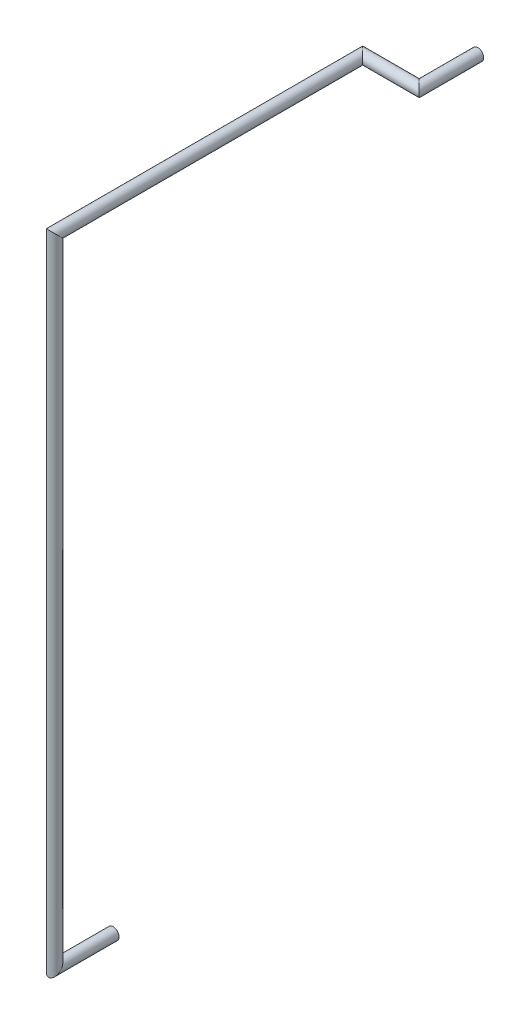
ISO-10303-21;
HEADER;
FILE_DESCRIPTION(('STEP AP214'),'2;1');
FILE_NAME('part.step','',(''),(''),'','','');
FILE_SCHEMA(('AUTOMOTIVE_DESIGN { 1 0 10303 214 1 1 1 1 }'));
ENDSEC;
DATA;
#1=APPLICATION_CONTEXT('core data for automotive mechanical design processes');
#2=APPLICATION_PROTOCOL_DEFINITION('international standard','automotive_design',2000,#1);
#3=PRODUCT_CONTEXT('',#1,'mechanical');
#4=PRODUCT('Part','Part','',(#3));
#5=PRODUCT_RELATED_PRODUCT_CATEGORY('part','',(#4));
#6=PRODUCT_DEFINITION_FORMATION('','',#4);
#7=PRODUCT_DEFINITION_CONTEXT('part definition',#1,'design');
#8=PRODUCT_DEFINITION('design','',#6,#7);
#9=PRODUCT_DEFINITION_SHAPE('','',#8);
#10=(LENGTH_UNIT() NAMED_UNIT(*) SI_UNIT(.MILLI.,.METRE.));
#11=(NAMED_UNIT(*) PLANE_ANGLE_UNIT() SI_UNIT($,.RADIAN.));
#12=(NAMED_UNIT(*) SI_UNIT($,.STERADIAN.) SOLID_ANGLE_UNIT());
#13=UNCERTAINTY_MEASURE_WITH_UNIT(LENGTH_MEASURE(1.E-05),#10,'distance_accuracy_value','');
#14=(GEOMETRIC_REPRESENTATION_CONTEXT(3) GLOBAL_UNCERTAINTY_ASSIGNED_CONTEXT((#13)) GLOBAL_UNIT_ASSIGNED_CONTEXT((#10,
#11,#12)) REPRESENTATION_CONTEXT('',''));
#15=CARTESIAN_POINT('',(0.,0.,0.));
#16=DIRECTION('',(0.,0.,1.));
#17=DIRECTION('',(1.,0.,0.));
#18=AXIS2_PLACEMENT_3D('',#15,#16,#17);
#19=CARTESIAN_POINT('',(4.82,54.22,-26.29));
#20=DIRECTION('',(0.,0.,-1.));
#21=DIRECTION('',(1.,0.,0.));
#22=AXIS2_PLACEMENT_3D('',#19,#20,#21);
#23=PLANE('',#22);
#24=CARTESIAN_POINT('',(4.82,54.22,-26.29));
#25=DIRECTION('',(0.,0.,-1.));
#26=DIRECTION('',(1.,0.,0.));
#27=AXIS2_PLACEMENT_3D('',#24,#25,#26);
#28=CIRCLE('',#27,0.5);
#29=CARTESIAN_POINT('',(5.32000000000001,54.22,-26.29));
#30=VERTEX_POINT('',#29);
#31=EDGE_CURVE('E44',#30,#30,#28,.T.);
#32=ORIENTED_EDGE('',*,*,#31,.T.);
#33=EDGE_LOOP('',(#32));
#34=FACE_BOUND('',#33,.T.);
#35=ADVANCED_FACE('F41',(#34),#23,.T.);
#36=CARTESIAN_POINT('',(0.,0.,0.));
#37=DIRECTION('',(0.,0.,1.));
#38=DIRECTION('',(1.,0.,0.));
#39=AXIS2_PLACEMENT_3D('',#36,#37,#38);
#40=PLANE('',#39);
#41=CARTESIAN_POINT('',(0.,0.,0.));
#42=DIRECTION('',(0.,0.,1.));
#43=DIRECTION('',(1.,0.,0.));
#44=AXIS2_PLACEMENT_3D('',#41,#42,#43);
#45=CIRCLE('',#44,0.5);
#46=CARTESIAN_POINT('',(0.5,0.,0.));
#47=VERTEX_POINT('',#46);
#48=EDGE_CURVE('E48',#47,#47,#45,.T.);
#49=ORIENTED_EDGE('',*,*,#48,.F.);
#50=EDGE_LOOP('',(#49));
#51=FACE_BOUND('',#50,.T.);
#52=ADVANCED_FACE('F71',(#51),#40,.F.);
#53=CARTESIAN_POINT('',(4.82,54.22,-20.64));
#54=DIRECTION('',(0.,0.,-1.));
#55=DIRECTION('',(-1.,0.,0.));
#56=AXIS2_PLACEMENT_3D('',#53,#54,#55);
#57=CYLINDRICAL_SURFACE('',#56,0.5);
#58=CARTESIAN_POINT('',(4.82,54.22,-21.29));
#59=DIRECTION('',(0.707106781186547,0.,-0.707106781186547));
#60=DIRECTION('',(0.707106781186548,0.,0.707106781186548));
#61=AXIS2_PLACEMENT_3D('',#58,#59,#60);
#62=ELLIPSE('',#61,0.707106781186548,0.5);
#63=CARTESIAN_POINT('',(5.32,54.22,-20.79));
#64=VERTEX_POINT('',#63);
#65=EDGE_CURVE('E60',#64,#64,#62,.F.);
#66=ORIENTED_EDGE('',*,*,#65,.F.);
#67=EDGE_LOOP('',(#66));
#68=FACE_BOUND('',#67,.T.);
#69=ORIENTED_EDGE('',*,*,#31,.F.);
#70=EDGE_LOOP('',(#69));
#71=FACE_BOUND('',#70,.T.);
#72=ADVANCED_FACE('F68',(#68,#71),#57,.T.);
#73=CARTESIAN_POINT('',(-0.649999999999997,54.22,-21.29));
#74=DIRECTION('',(1.,0.,0.));
#75=DIRECTION('',(0.,0.,-1.));
#76=AXIS2_PLACEMENT_3D('',#73,#74,#75);
#77=CYLINDRICAL_SURFACE('',#76,0.5);
#78=CARTESIAN_POINT('',(0.,54.22,-21.29));
#79=DIRECTION('',(0.707106781186548,0.,-0.707106781186548));
#80=DIRECTION('',(-0.707106781186548,0.,-0.707106781186548));
#81=AXIS2_PLACEMENT_3D('',#78,#79,#80);
#82=ELLIPSE('',#81,0.707106781186547,0.5);
#83=CARTESIAN_POINT('',(-0.5,54.22,-21.79));
#84=VERTEX_POINT('',#83);
#85=EDGE_CURVE('E58',#84,#84,#82,.F.);
#86=ORIENTED_EDGE('',*,*,#85,.F.);
#87=EDGE_LOOP('',(#86));
#88=FACE_BOUND('',#87,.T.);
#89=ORIENTED_EDGE('',*,*,#65,.T.);
#90=EDGE_LOOP('',(#89));
#91=FACE_BOUND('',#90,.T.);
#92=ADVANCED_FACE('F70',(#88,#91),#77,.T.);
#93=CARTESIAN_POINT('',(0.,54.22,6.2));
#94=DIRECTION('',(0.,0.,-1.));
#95=DIRECTION('',(-1.,0.,0.));
#96=AXIS2_PLACEMENT_3D('',#93,#94,#95);
#97=CYLINDRICAL_SURFACE('',#96,0.5);
#98=CARTESIAN_POINT('',(0.,54.22,5.));
#99=DIRECTION('',(0.,0.707106781186548,-0.707106781186548));
#100=DIRECTION('',(0.,0.707106781186548,0.707106781186548));
#101=AXIS2_PLACEMENT_3D('',#98,#99,#100);
#102=ELLIPSE('',#101,0.707106781186547,0.5);
#103=CARTESIAN_POINT('',(0.,54.72,5.5));
#104=VERTEX_POINT('',#103);
#105=EDGE_CURVE('E53',#104,#104,#102,.F.);
#106=ORIENTED_EDGE('',*,*,#105,.F.);
#107=EDGE_LOOP('',(#106));
#108=FACE_BOUND('',#107,.T.);
#109=ORIENTED_EDGE('',*,*,#85,.T.);
#110=EDGE_LOOP('',(#109));
#111=FACE_BOUND('',#110,.T.);
#112=ADVANCED_FACE('F78',(#108,#111),#97,.T.);
#113=CARTESIAN_POINT('',(0.,-1.2,5.));
#114=DIRECTION('',(0.,1.,0.));
#115=DIRECTION('',(0.,0.,1.));
#116=AXIS2_PLACEMENT_3D('',#113,#114,#115);
#117=CYLINDRICAL_SURFACE('',#116,0.5);
#118=CARTESIAN_POINT('',(0.,0.,5.));
#119=DIRECTION('',(0.,0.707106781186547,0.707106781186547));
#120=DIRECTION('',(0.,-0.707106781186548,0.707106781186548));
#121=AXIS2_PLACEMENT_3D('',#118,#119,#120);
#122=ELLIPSE('',#121,0.707106781186548,0.5);
#123=CARTESIAN_POINT('',(0.,-0.5,5.5));
#124=VERTEX_POINT('',#123);
#125=EDGE_CURVE('E10',#124,#124,#122,.F.);
#126=ORIENTED_EDGE('',*,*,#125,.F.);
#127=EDGE_LOOP('',(#126));
#128=FACE_BOUND('',#127,.T.);
#129=ORIENTED_EDGE('',*,*,#105,.T.);
#130=EDGE_LOOP('',(#129));
#131=FACE_BOUND('',#130,.T.);
#132=ADVANCED_FACE('F84',(#128,#131),#117,.T.);
#133=CARTESIAN_POINT('',(0.,0.,0.));
#134=DIRECTION('',(0.,0.,1.));
#135=DIRECTION('',(1.,0.,0.));
#136=AXIS2_PLACEMENT_3D('',#133,#134,#135);
#137=CYLINDRICAL_SURFACE('',#136,0.5);
#138=ORIENTED_EDGE('',*,*,#48,.T.);
#139=EDGE_LOOP('',(#138));
#140=FACE_BOUND('',#139,.T.);
#141=ORIENTED_EDGE('',*,*,#125,.T.);
#142=EDGE_LOOP('',(#141));
#143=FACE_BOUND('',#142,.T.);
#144=ADVANCED_FACE('F82',(#140,#143),#137,.T.);
#145=CLOSED_SHELL('',(#35,#52,#72,#92,#112,#132,#144));
#146=MANIFOLD_SOLID_BREP('B2',#145);
#147=ADVANCED_BREP_SHAPE_REPRESENTATION('',(#18,#146),#14);
#148=SHAPE_DEFINITION_REPRESENTATION(#9,#147);
ENDSEC;
END-ISO-10303-21;
